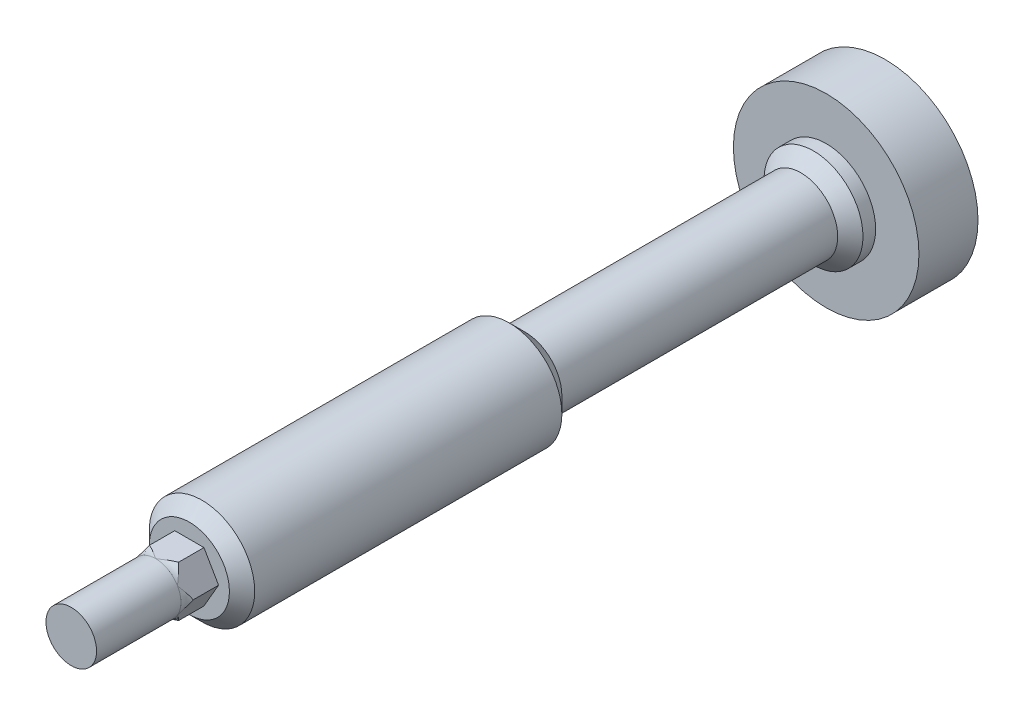
ISO-10303-21;
HEADER;
FILE_DESCRIPTION(('STEP AP214'),'2;1');
FILE_NAME('part.step','',(''),(''),'','','');
FILE_SCHEMA(('AUTOMOTIVE_DESIGN { 1 0 10303 214 1 1 1 1 }'));
ENDSEC;
DATA;
#1=APPLICATION_CONTEXT('core data for automotive mechanical design processes');
#2=APPLICATION_PROTOCOL_DEFINITION('international standard','automotive_design',2000,#1);
#3=PRODUCT_CONTEXT('',#1,'mechanical');
#4=PRODUCT('Part','Part','',(#3));
#5=PRODUCT_RELATED_PRODUCT_CATEGORY('part','',(#4));
#6=PRODUCT_DEFINITION_FORMATION('','',#4);
#7=PRODUCT_DEFINITION_CONTEXT('part definition',#1,'design');
#8=PRODUCT_DEFINITION('design','',#6,#7);
#9=PRODUCT_DEFINITION_SHAPE('','',#8);
#10=(LENGTH_UNIT() NAMED_UNIT(*) SI_UNIT(.MILLI.,.METRE.));
#11=(NAMED_UNIT(*) PLANE_ANGLE_UNIT() SI_UNIT($,.RADIAN.));
#12=(NAMED_UNIT(*) SI_UNIT($,.STERADIAN.) SOLID_ANGLE_UNIT());
#13=UNCERTAINTY_MEASURE_WITH_UNIT(LENGTH_MEASURE(1.E-05),#10,'distance_accuracy_value','');
#14=(GEOMETRIC_REPRESENTATION_CONTEXT(3) GLOBAL_UNCERTAINTY_ASSIGNED_CONTEXT((#13)) GLOBAL_UNIT_ASSIGNED_CONTEXT((#10,
#11,#12)) REPRESENTATION_CONTEXT('',''));
#15=CARTESIAN_POINT('',(0.,0.,0.));
#16=DIRECTION('',(0.,0.,1.));
#17=DIRECTION('',(1.,0.,0.));
#18=AXIS2_PLACEMENT_3D('',#15,#16,#17);
#19=CARTESIAN_POINT('',(1.73205080756888,-3.,14.));
#20=DIRECTION('',(-0.866025403784439,0.499999999999999,0.));
#21=DIRECTION('',(-0.499999999999999,-0.866025403784439,0.));
#22=AXIS2_PLACEMENT_3D('',#19,#20,#21);
#23=PLANE('',#22);
#24=CARTESIAN_POINT('',(2.59807621135332,-1.5,4.));
#25=CARTESIAN_POINT('',(2.599599533553,-1.49736152855384,3.99798721601837));
#26=CARTESIAN_POINT('',(2.60112285493995,-1.49472305851539,3.9959744315867));
#27=CARTESIAN_POINT('',(2.69421432975069,-1.33348389439165,3.8729727752807));
#28=CARTESIAN_POINT('',(2.78579879971617,-1.17485493922718,3.7520406323784));
#29=CARTESIAN_POINT('',(2.97118279688303,-0.853760437224003,3.51747525539667));
#30=CARTESIAN_POINT('',(3.06497896578776,-0.69130070712569,3.40383182139355));
#31=CARTESIAN_POINT('',(3.20922966384739,-0.441451169059126,3.24433248312488));
#32=CARTESIAN_POINT('',(3.25810359156913,-0.356799043079634,3.19281450562385));
#33=CARTESIAN_POINT('',(3.35708417718983,-0.185359639821659,3.09486519304067));
#34=CARTESIAN_POINT('',(3.40719011852256,-0.0985736036723064,3.04843098299515));
#35=CARTESIAN_POINT('',(3.5091899446179,0.0780952774880227,2.96159736959385));
#36=CARTESIAN_POINT('',(3.56109490880566,0.167997312626272,2.9212490974226));
#37=CARTESIAN_POINT('',(3.66640306272262,0.350396385661716,2.84856759575737));
#38=CARTESIAN_POINT('',(3.71980921111245,0.442898548109464,2.81625164013146));
#39=CARTESIAN_POINT('',(3.77390202125899,0.536590043607451,2.78880943720969));
#40=B_SPLINE_CURVE_WITH_KNOTS('',3,(#24,#25,#26,#27,#28,#29,#30,#31,#32,#33,#34,#35,#36,#37,#38,
#39),.UNSPECIFIED.,.F.,.F.,(4,2,2,2,2,2,2,4),(0.,0.0109544511501199,0.669433908200344,
1.32697081357057,1.65833374603016,1.98950830806198,2.3233264484579,2.65785638686686),.UNSPECIFIED.);
#41=CARTESIAN_POINT('',(2.59807621135332,-1.5,4.));
#42=VERTEX_POINT('',#41);
#43=CARTESIAN_POINT('',(3.46410161513775,0.,3.));
#44=VERTEX_POINT('',#43);
#45=EDGE_CURVE('E171',#42,#44,#40,.T.);
#46=ORIENTED_EDGE('',*,*,#45,.F.);
#47=CARTESIAN_POINT('',(2.59807621135332,-1.5,4.));
#48=CARTESIAN_POINT('',(2.59655288915364,-1.50263847144614,3.99798721601835));
#49=CARTESIAN_POINT('',(2.5950295677667,-1.50527694148457,3.99597443158666));
#50=CARTESIAN_POINT('',(2.50193809295646,-1.66651610560741,3.87297277527947));
#51=CARTESIAN_POINT('',(2.41035362299075,-1.8251450607723,3.75204063237828));
#52=CARTESIAN_POINT('',(2.22496962582385,-2.14623956277559,3.51747525539746));
#53=CARTESIAN_POINT('',(2.13117345691929,-2.30869929287359,3.40383182139413));
#54=CARTESIAN_POINT('',(1.9869227588598,-2.55854883093991,3.24433248312542));
#55=CARTESIAN_POINT('',(1.93804883113807,-2.64320095691939,3.19281450562441));
#56=CARTESIAN_POINT('',(1.8390682455174,-2.81464036017732,3.09486519304124));
#57=CARTESIAN_POINT('',(1.78896230418469,-2.90142639632664,3.0484309829957));
#58=CARTESIAN_POINT('',(1.68696247808942,-3.07809527748682,2.9615973695944));
#59=CARTESIAN_POINT('',(1.63505751390173,-3.16799731262495,2.92124909742317));
#60=CARTESIAN_POINT('',(1.52974935998492,-3.35039638566015,2.84856759575795));
#61=CARTESIAN_POINT('',(1.47634321159517,-3.44289854810776,2.81625164013202));
#62=CARTESIAN_POINT('',(1.42225040144871,-3.53659004360561,2.78880943721023));
#63=B_SPLINE_CURVE_WITH_KNOTS('',3,(#47,#48,#49,#50,#51,#52,#53,#54,#55,#56,#57,#58,#59,#60,#61,
#62),.UNSPECIFIED.,.F.,.F.,(4,2,2,2,2,2,2,4),(0.,0.0109544511501199,0.669433908199705,
1.32697081356937,1.65833374602888,1.98950830806062,2.32332644845615,2.65785638686467),.UNSPECIFIED.);
#64=CARTESIAN_POINT('',(1.73205080756888,-3.,3.));
#65=VERTEX_POINT('',#64);
#66=EDGE_CURVE('E225',#65,#42,#63,.F.);
#67=ORIENTED_EDGE('',*,*,#66,.F.);
#68=DIRECTION('',(0.,0.,-1.));
#69=VECTOR('',#68,1.);
#70=CARTESIAN_POINT('',(1.73205080756888,-3.,14.));
#71=LINE('',#70,#69);
#72=CARTESIAN_POINT('',(1.73205080756888,-3.,0.));
#73=VERTEX_POINT('',#72);
#74=EDGE_CURVE('E355',#65,#73,#71,.T.);
#75=ORIENTED_EDGE('',*,*,#74,.T.);
#76=DIRECTION('',(0.499999999999999,0.866025403784439,0.));
#77=VECTOR('',#76,1.);
#78=CARTESIAN_POINT('',(1.73205080756888,-3.,0.));
#79=LINE('',#78,#77);
#80=CARTESIAN_POINT('',(3.46410161513775,0.,0.));
#81=VERTEX_POINT('',#80);
#82=EDGE_CURVE('E375',#73,#81,#79,.T.);
#83=ORIENTED_EDGE('',*,*,#82,.T.);
#84=DIRECTION('',(0.,0.,-1.));
#85=VECTOR('',#84,1.);
#86=CARTESIAN_POINT('',(3.46410161513775,0.,14.));
#87=LINE('',#86,#85);
#88=EDGE_CURVE('E341',#44,#81,#87,.T.);
#89=ORIENTED_EDGE('',*,*,#88,.F.);
#90=EDGE_LOOP('',(#46,#67,#75,#83,#89));
#91=FACE_BOUND('',#90,.T.);
#92=ADVANCED_FACE('F42',(#91),#23,.F.);
#93=CARTESIAN_POINT('',(3.46410161513775,0.,14.));
#94=DIRECTION('',(-0.866025403784438,-0.5,0.));
#95=DIRECTION('',(0.5,-0.866025403784439,0.));
#96=AXIS2_PLACEMENT_3D('',#93,#94,#95);
#97=PLANE('',#96);
#98=CARTESIAN_POINT('',(2.59807621135332,1.5,4.));
#99=CARTESIAN_POINT('',(2.59655288915363,1.50263847144616,3.99798721601837));
#100=CARTESIAN_POINT('',(2.59502956776668,1.5052769414846,3.9959744315867));
#101=CARTESIAN_POINT('',(2.50193809295593,1.66651610560834,3.8729727752807));
#102=CARTESIAN_POINT('',(2.41035362299045,1.82514506077281,3.7520406323784));
#103=CARTESIAN_POINT('',(2.22496962582361,2.146239562776,3.51747525539667));
#104=CARTESIAN_POINT('',(2.13117345691887,2.30869929287431,3.40383182139355));
#105=CARTESIAN_POINT('',(1.98692275885924,2.55854883094088,3.24433248312487));
#106=CARTESIAN_POINT('',(1.9380488311375,2.64320095692037,3.19281450562384));
#107=CARTESIAN_POINT('',(1.8390682455168,2.81464036017835,3.09486519304067));
#108=CARTESIAN_POINT('',(1.78896230418407,2.9014263963277,3.04843098299515));
#109=CARTESIAN_POINT('',(1.68696247808872,3.07809527748803,2.96159736959384));
#110=CARTESIAN_POINT('',(1.63505751390096,3.16799731262628,2.9212490974226));
#111=CARTESIAN_POINT('',(1.52974935998401,3.35039638566173,2.84856759575737));
#112=CARTESIAN_POINT('',(1.47634321159418,3.44289854810947,2.81625164013145));
#113=CARTESIAN_POINT('',(1.42225040144763,3.53659004360746,2.78880943720969));
#114=B_SPLINE_CURVE_WITH_KNOTS('',3,(#98,#99,#100,#101,#102,#103,#104,#105,#106,#107,#108,#109,
#110,#111,#112,#113),.UNSPECIFIED.,.F.,.F.,(4,2,2,2,2,2,2,4),(0.,0.01095445115012,
0.66943390820035,1.32697081357058,1.65833374603018,1.98950830806199,2.32332644845792,
2.65785638686687),.UNSPECIFIED.);
#115=CARTESIAN_POINT('',(2.59807621135332,1.5,4.));
#116=VERTEX_POINT('',#115);
#117=CARTESIAN_POINT('',(1.73205080756888,3.,3.));
#118=VERTEX_POINT('',#117);
#119=EDGE_CURVE('E142',#116,#118,#114,.T.);
#120=ORIENTED_EDGE('',*,*,#119,.F.);
#121=CARTESIAN_POINT('',(2.59807621135332,1.5,4.));
#122=CARTESIAN_POINT('',(2.59959953355299,1.49736152855387,3.99798721601834));
#123=CARTESIAN_POINT('',(2.60112285493993,1.49472305851544,3.99597443158664));
#124=CARTESIAN_POINT('',(2.6942143297499,1.33348389439304,3.87297277527887));
#125=CARTESIAN_POINT('',(2.78579879971574,1.17485493922795,3.75204063237823));
#126=CARTESIAN_POINT('',(2.97118279688267,0.853760437224613,3.51747525539785));
#127=CARTESIAN_POINT('',(3.06497896578714,0.691300707126764,3.40383182139442));
#128=CARTESIAN_POINT('',(3.20922966384657,0.441451169060558,3.24433248312569));
#129=CARTESIAN_POINT('',(3.25810359156829,0.356799043081089,3.19281450562469));
#130=CARTESIAN_POINT('',(3.35708417718895,0.185359639823183,3.09486519304152));
#131=CARTESIAN_POINT('',(3.40719011852165,0.0985736036738755,3.04843098299597));
#132=CARTESIAN_POINT('',(3.50918994461687,-0.0780952774862371,2.96159736959467));
#133=CARTESIAN_POINT('',(3.56109490880453,-0.167997312624312,2.92124909742345));
#134=CARTESIAN_POINT('',(3.66640306272127,-0.350396385659384,2.84856759575823));
#135=CARTESIAN_POINT('',(3.71980921111099,-0.442898548106933,2.8162516401323));
#136=CARTESIAN_POINT('',(3.77390202125741,-0.536590043604715,2.78880943721049));
#137=B_SPLINE_CURVE_WITH_KNOTS('',3,(#121,#122,#123,#124,#125,#126,#127,#128,#129,#130,#131,
#132,#133,#134,#135,#136),.UNSPECIFIED.,.F.,.F.,(4,2,2,2,2,2,2,4),(0.,0.0109544511501195,
0.669433908199392,1.32697081356878,1.65833374602825,1.98950830805996,2.3233264484553,
2.65785638686361),.UNSPECIFIED.);
#138=EDGE_CURVE('E165',#44,#116,#137,.F.);
#139=ORIENTED_EDGE('',*,*,#138,.F.);
#140=ORIENTED_EDGE('',*,*,#88,.T.);
#141=DIRECTION('',(-0.5,0.866025403784439,0.));
#142=VECTOR('',#141,1.);
#143=CARTESIAN_POINT('',(3.46410161513775,0.,0.));
#144=LINE('',#143,#142);
#145=CARTESIAN_POINT('',(1.73205080756888,3.,0.));
#146=VERTEX_POINT('',#145);
#147=EDGE_CURVE('E372',#81,#146,#144,.T.);
#148=ORIENTED_EDGE('',*,*,#147,.T.);
#149=DIRECTION('',(0.,0.,-1.));
#150=VECTOR('',#149,1.);
#151=CARTESIAN_POINT('',(1.73205080756888,3.,14.));
#152=LINE('',#151,#150);
#153=EDGE_CURVE('E344',#118,#146,#152,.T.);
#154=ORIENTED_EDGE('',*,*,#153,.F.);
#155=EDGE_LOOP('',(#120,#139,#140,#148,#154));
#156=FACE_BOUND('',#155,.T.);
#157=ADVANCED_FACE('F261',(#156),#97,.F.);
#158=CARTESIAN_POINT('',(1.73205080756888,3.,14.));
#159=DIRECTION('',(0.,-1.,0.));
#160=DIRECTION('',(1.,0.,0.));
#161=AXIS2_PLACEMENT_3D('',#158,#159,#160);
#162=PLANE('',#161);
#163=CARTESIAN_POINT('',(0.,3.,4.));
#164=CARTESIAN_POINT('',(-0.00304664242886925,3.,3.99798721785063));
#165=CARTESIAN_POINT('',(-0.00609328523506538,3.,3.99597443338881));
#166=CARTESIAN_POINT('',(-0.193668665200186,2.99999999999999,3.87205283667219));
#167=CARTESIAN_POINT('',(-0.37823752327317,3.,3.750195120646));
#168=CARTESIAN_POINT('',(-0.752344298595047,3.,3.51367741960016));
#169=CARTESIAN_POINT('',(-0.941887200009458,3.,3.39902507798546));
#170=CARTESIAN_POINT('',(-1.32869087993365,3.,3.18587267007861));
#171=CARTESIAN_POINT('',(-1.52590203185111,3.,3.08728504877374));
#172=CARTESIAN_POINT('',(-1.93100279537539,3.,2.91575979696371));
#173=CARTESIAN_POINT('',(-2.13885263606816,3.,2.84273363961717));
#174=CARTESIAN_POINT('',(-2.49303136016625,3.,2.75298318653353));
#175=CARTESIAN_POINT('',(-2.63659566701067,3.,2.72558859568115));
#176=CARTESIAN_POINT('',(-2.92596214329407,3.,2.6923260839869));
#177=CARTESIAN_POINT('',(-3.07175467515037,3.,2.68638285030505));
#178=CARTESIAN_POINT('',(-3.32547640929926,3.,2.69908024292703));
#179=CARTESIAN_POINT('',(-3.43366060869138,3.,2.71188614941616));
#180=CARTESIAN_POINT('',(-3.64754526403645,3.,2.75450885431063));
#181=CARTESIAN_POINT('',(-3.75321543462677,3.,2.78447455052692));
#182=CARTESIAN_POINT('',(-3.85571869660119,3.,2.82406496439945));
#183=B_SPLINE_CURVE_WITH_KNOTS('',3,(#163,#164,#165,#166,#167,#168,#169,#170,#171,#172,#173,
#174,#175,#176,#177,#178,#179,#180,#181,#182),.UNSPECIFIED.,.F.,.F.,(4,2,2,2,2,2,2,2,2,4),(0.,
0.0109544511501202,0.674440060517647,1.33861800667784,1.99904537494895,2.65716231713276,
3.09440313837515,3.53010736429974,3.85567082698896,4.18410300415164),.UNSPECIFIED.);
#184=CARTESIAN_POINT('',(0.,3.,4.));
#185=VERTEX_POINT('',#184);
#186=CARTESIAN_POINT('',(-1.73205080756888,3.,3.));
#187=VERTEX_POINT('',#186);
#188=EDGE_CURVE('E136',#185,#187,#183,.T.);
#189=ORIENTED_EDGE('',*,*,#188,.F.);
#190=CARTESIAN_POINT('',(0.,3.,4.));
#191=CARTESIAN_POINT('',(0.00304664242886842,3.,3.99798721785063));
#192=CARTESIAN_POINT('',(0.00609328523506447,3.,3.99597443338881));
#193=CARTESIAN_POINT('',(0.193668665200183,3.,3.87205283667218));
#194=CARTESIAN_POINT('',(0.378237523273169,3.,3.750195120646));
#195=CARTESIAN_POINT('',(0.752344298595045,3.,3.51367741960016));
#196=CARTESIAN_POINT('',(0.941887200009455,3.,3.39902507798546));
#197=CARTESIAN_POINT('',(1.32869087993365,3.,3.18587267007861));
#198=CARTESIAN_POINT('',(1.52590203185111,3.,3.08728504877374));
#199=CARTESIAN_POINT('',(1.93100279537539,3.,2.91575979696371));
#200=CARTESIAN_POINT('',(2.13885263606816,3.,2.84273363961717));
#201=CARTESIAN_POINT('',(2.49303136016624,3.,2.75298318653353));
#202=CARTESIAN_POINT('',(2.63659566701067,3.,2.72558859568115));
#203=CARTESIAN_POINT('',(2.92596214329407,3.,2.6923260839869));
#204=CARTESIAN_POINT('',(3.07175467515036,3.,2.68638285030505));
#205=CARTESIAN_POINT('',(3.32547640929925,3.,2.69908024292703));
#206=CARTESIAN_POINT('',(3.43366060869138,3.,2.71188614941615));
#207=CARTESIAN_POINT('',(3.64754526403645,3.,2.75450885431063));
#208=CARTESIAN_POINT('',(3.75321543462677,3.,2.78447455052692));
#209=CARTESIAN_POINT('',(3.85571869660118,3.,2.82406496439944));
#210=B_SPLINE_CURVE_WITH_KNOTS('',3,(#190,#191,#192,#193,#194,#195,#196,#197,#198,#199,#200,
#201,#202,#203,#204,#205,#206,#207,#208,#209),.UNSPECIFIED.,.F.,.F.,(4,2,2,2,2,2,2,2,2,4),(0.,
0.01095445115012,0.674440060517646,1.33861800667783,1.99904537494895,2.65716231713276,
3.09440313837514,3.53010736429974,3.85567082698896,4.18410300415163),.UNSPECIFIED.);
#211=EDGE_CURVE('E141',#118,#185,#210,.F.);
#212=ORIENTED_EDGE('',*,*,#211,.F.);
#213=ORIENTED_EDGE('',*,*,#153,.T.);
#214=DIRECTION('',(-1.,0.,0.));
#215=VECTOR('',#214,1.);
#216=CARTESIAN_POINT('',(1.73205080756888,3.,0.));
#217=LINE('',#216,#215);
#218=CARTESIAN_POINT('',(-1.73205080756888,3.,0.));
#219=VERTEX_POINT('',#218);
#220=EDGE_CURVE('E368',#146,#219,#217,.T.);
#221=ORIENTED_EDGE('',*,*,#220,.T.);
#222=DIRECTION('',(0.,0.,-1.));
#223=VECTOR('',#222,1.);
#224=CARTESIAN_POINT('',(-1.73205080756888,3.,14.));
#225=LINE('',#224,#223);
#226=EDGE_CURVE('E347',#187,#219,#225,.T.);
#227=ORIENTED_EDGE('',*,*,#226,.F.);
#228=EDGE_LOOP('',(#189,#212,#213,#221,#227));
#229=FACE_BOUND('',#228,.T.);
#230=ADVANCED_FACE('F258',(#229),#162,.F.);
#231=CARTESIAN_POINT('',(-1.73205080756888,3.,14.));
#232=DIRECTION('',(0.866025403784439,-0.499999999999999,0.));
#233=DIRECTION('',(0.5,0.866025403784439,0.));
#234=AXIS2_PLACEMENT_3D('',#231,#232,#233);
#235=PLANE('',#234);
#236=CARTESIAN_POINT('',(-2.59807621135332,1.5,4.));
#237=CARTESIAN_POINT('',(-2.59959953355302,1.49736152855381,3.99798721601843));
#238=CARTESIAN_POINT('',(-2.60112285493998,1.49472305851534,3.9959744315868));
#239=CARTESIAN_POINT('',(-2.69421432975188,1.33348389438958,3.87297277528345));
#240=CARTESIAN_POINT('',(-2.78579879971683,1.17485493922604,3.75204063237867));
#241=CARTESIAN_POINT('',(-2.97118279688355,0.853760437223093,3.51747525539492));
#242=CARTESIAN_POINT('',(-3.06497896578868,0.691300707124087,3.40383182139225));
#243=CARTESIAN_POINT('',(-3.20922966384862,0.441451169056989,3.24433248312365));
#244=CARTESIAN_POINT('',(-3.25810359157038,0.356799043077462,3.19281450562258));
#245=CARTESIAN_POINT('',(-3.35708417719114,0.185359639819384,3.0948651930394));
#246=CARTESIAN_POINT('',(-3.40719011852391,0.0985736036699641,3.04843098299392));
#247=CARTESIAN_POINT('',(-3.50918994461944,-0.0780952774906881,2.96159736959262));
#248=CARTESIAN_POINT('',(-3.56109490880735,-0.167997312629198,2.92124909742133));
#249=CARTESIAN_POINT('',(-3.66640306272463,-0.3503963856652,2.84856759575609));
#250=CARTESIAN_POINT('',(-3.71980921111463,-0.442898548113245,2.81625164013019));
#251=CARTESIAN_POINT('',(-3.77390202126135,-0.536590043611539,2.78880943720849));
#252=B_SPLINE_CURVE_WITH_KNOTS('',3,(#236,#237,#238,#239,#240,#241,#242,#243,#244,#245,#246,
#247,#248,#249,#250,#251),.UNSPECIFIED.,.F.,.F.,(4,2,2,2,2,2,2,4),(0.,0.0109544511501192,
0.66943390820177,1.32697081357325,1.65833374603303,1.98950830806499,2.3233264484618,
2.65785638687172),.UNSPECIFIED.);
#253=CARTESIAN_POINT('',(-2.59807621135332,1.5,4.));
#254=VERTEX_POINT('',#253);
#255=CARTESIAN_POINT('',(-3.46410161513775,0.,3.));
#256=VERTEX_POINT('',#255);
#257=EDGE_CURVE('E148',#254,#256,#252,.T.);
#258=ORIENTED_EDGE('',*,*,#257,.F.);
#259=CARTESIAN_POINT('',(-2.59807621135332,1.5,4.));
#260=CARTESIAN_POINT('',(-2.59655288915362,1.50263847144616,3.99798721601839));
#261=CARTESIAN_POINT('',(-2.59502956776667,1.50527694148462,3.99597443158674));
#262=CARTESIAN_POINT('',(-2.50193809295551,1.66651610560902,3.87297277528162));
#263=CARTESIAN_POINT('',(-2.41035362299023,1.82514506077319,3.75204063237849));
#264=CARTESIAN_POINT('',(-2.22496962582344,2.1462395627763,3.51747525539609));
#265=CARTESIAN_POINT('',(-2.13117345691857,2.30869929287484,3.40383182139312));
#266=CARTESIAN_POINT('',(-1.98692275885883,2.55854883094159,3.24433248312447));
#267=CARTESIAN_POINT('',(-1.93804883113709,2.64320095692109,3.19281450562342));
#268=CARTESIAN_POINT('',(-1.83906824551637,2.8146403601791,3.09486519304025));
#269=CARTESIAN_POINT('',(-1.78896230418362,2.90142639632848,3.04843098299474));
#270=CARTESIAN_POINT('',(-1.68696247808822,3.07809527748891,2.96159736959344));
#271=CARTESIAN_POINT('',(-1.6350575139004,3.16799731262725,2.92124909742218));
#272=CARTESIAN_POINT('',(-1.52974935998334,3.35039638566288,2.84856759575694));
#273=CARTESIAN_POINT('',(-1.47634321159345,3.44289854811073,2.81625164013103));
#274=CARTESIAN_POINT('',(-1.42225040144685,3.53659004360882,2.78880943720929));
#275=B_SPLINE_CURVE_WITH_KNOTS('',3,(#259,#260,#261,#262,#263,#264,#265,#266,#267,#268,#269,
#270,#271,#272,#273,#274),.UNSPECIFIED.,.F.,.F.,(4,2,2,2,2,2,2,4),(0.,0.0109544511501208,
0.669433908200823,1.32697081357147,1.65833374603113,1.98950830806299,2.32332644845921,
2.65785638686849),.UNSPECIFIED.);
#276=EDGE_CURVE('E129',#187,#254,#275,.F.);
#277=ORIENTED_EDGE('',*,*,#276,.F.);
#278=ORIENTED_EDGE('',*,*,#226,.T.);
#279=DIRECTION('',(-0.499999999999999,-0.866025403784439,0.));
#280=VECTOR('',#279,1.);
#281=CARTESIAN_POINT('',(-1.73205080756888,3.,0.));
#282=LINE('',#281,#280);
#283=CARTESIAN_POINT('',(-3.46410161513775,0.,0.));
#284=VERTEX_POINT('',#283);
#285=EDGE_CURVE('E366',#219,#284,#282,.T.);
#286=ORIENTED_EDGE('',*,*,#285,.T.);
#287=DIRECTION('',(0.,0.,-1.));
#288=VECTOR('',#287,1.);
#289=CARTESIAN_POINT('',(-3.46410161513775,0.,14.));
#290=LINE('',#289,#288);
#291=EDGE_CURVE('E163',#256,#284,#290,.T.);
#292=ORIENTED_EDGE('',*,*,#291,.F.);
#293=EDGE_LOOP('',(#258,#277,#278,#286,#292));
#294=FACE_BOUND('',#293,.T.);
#295=ADVANCED_FACE('F161',(#294),#235,.F.);
#296=CARTESIAN_POINT('',(-3.46410161513775,0.,14.));
#297=DIRECTION('',(0.866025403784438,0.5,0.));
#298=DIRECTION('',(-0.5,0.866025403784438,0.));
#299=AXIS2_PLACEMENT_3D('',#296,#297,#298);
#300=PLANE('',#299);
#301=CARTESIAN_POINT('',(-2.59807621135332,-1.5,4.));
#302=CARTESIAN_POINT('',(-2.59655288915363,-1.50263847144616,3.99798721601838));
#303=CARTESIAN_POINT('',(-2.59502956776668,-1.50527694148461,3.99597443158671));
#304=CARTESIAN_POINT('',(-2.50193809295579,-1.66651610560857,3.87297277528101));
#305=CARTESIAN_POINT('',(-2.41035362299038,-1.82514506077294,3.75204063237843));
#306=CARTESIAN_POINT('',(-2.22496962582355,-2.1462395627761,3.51747525539648));
#307=CARTESIAN_POINT('',(-2.13117345691877,-2.30869929287448,3.40383182139341));
#308=CARTESIAN_POINT('',(-1.9869227588591,-2.55854883094111,3.24433248312474));
#309=CARTESIAN_POINT('',(-1.93804883113737,-2.6432009569206,3.19281450562371));
#310=CARTESIAN_POINT('',(-1.83906824551666,-2.81464036017859,3.09486519304053));
#311=CARTESIAN_POINT('',(-1.78896230418393,-2.90142639632795,3.04843098299502));
#312=CARTESIAN_POINT('',(-1.68696247808856,-3.07809527748831,2.96159736959371));
#313=CARTESIAN_POINT('',(-1.63505751390078,-3.16799731262659,2.92124909742246));
#314=CARTESIAN_POINT('',(-1.52974935998379,-3.3503963856621,2.84856759575723));
#315=CARTESIAN_POINT('',(-1.47634321159394,-3.44289854810988,2.81625164013132));
#316=CARTESIAN_POINT('',(-1.42225040144738,-3.5365900436079,2.78880943720956));
#317=B_SPLINE_CURVE_WITH_KNOTS('',3,(#301,#302,#303,#304,#305,#306,#307,#308,#309,#310,#311,
#312,#313,#314,#315,#316),.UNSPECIFIED.,.F.,.F.,(4,2,2,2,2,2,2,4),(0.,0.0109544511501195,
0.669433908200502,1.32697081357087,1.65833374603048,1.98950830806231,2.32332644845833,
2.65785638686739),.UNSPECIFIED.);
#318=CARTESIAN_POINT('',(-2.59807621135332,-1.5,4.));
#319=VERTEX_POINT('',#318);
#320=CARTESIAN_POINT('',(-1.73205080756888,-3.,3.));
#321=VERTEX_POINT('',#320);
#322=EDGE_CURVE('E68',#319,#321,#317,.T.);
#323=ORIENTED_EDGE('',*,*,#322,.F.);
#324=CARTESIAN_POINT('',(-2.59807621135332,-1.5,4.));
#325=CARTESIAN_POINT('',(-2.59959953355299,-1.49736152855386,3.99798721601835));
#326=CARTESIAN_POINT('',(-2.60112285493993,-1.49472305851543,3.99597443158665));
#327=CARTESIAN_POINT('',(-2.69421432975003,-1.33348389439281,3.87297277527917));
#328=CARTESIAN_POINT('',(-2.78579879971581,-1.17485493922782,3.75204063237826));
#329=CARTESIAN_POINT('',(-2.97118279688273,-0.853760437224512,3.51747525539765));
#330=CARTESIAN_POINT('',(-3.06497896578724,-0.691300707126588,3.40383182139428));
#331=CARTESIAN_POINT('',(-3.2092296638467,-0.441451169060323,3.24433248312556));
#332=CARTESIAN_POINT('',(-3.25810359156843,-0.35679904308085,3.19281450562455));
#333=CARTESIAN_POINT('',(-3.35708417718909,-0.185359639822933,3.09486519304138));
#334=CARTESIAN_POINT('',(-3.4071901185218,-0.0985736036736186,3.04843098299584));
#335=CARTESIAN_POINT('',(-3.50918994461704,0.0780952774865295,2.96159736959454));
#336=CARTESIAN_POINT('',(-3.56109490880472,0.167997312624633,2.92124909742331));
#337=CARTESIAN_POINT('',(-3.66640306272149,0.350396385659766,2.84856759575809));
#338=CARTESIAN_POINT('',(-3.71980921111123,0.442898548107349,2.81625164013216));
#339=CARTESIAN_POINT('',(-3.77390202125767,0.536590043605164,2.78880943721036));
#340=B_SPLINE_CURVE_WITH_KNOTS('',3,(#324,#325,#326,#327,#328,#329,#330,#331,#332,#333,#334,
#335,#336,#337,#338,#339),.UNSPECIFIED.,.F.,.F.,(4,2,2,2,2,2,2,4),(0.,0.0109544511501205,
0.66943390819955,1.32697081356908,1.65833374602856,1.98950830806029,2.32332644845572,
2.65785638686414),.UNSPECIFIED.);
#341=EDGE_CURVE('E150',#256,#319,#340,.F.);
#342=ORIENTED_EDGE('',*,*,#341,.F.);
#343=ORIENTED_EDGE('',*,*,#291,.T.);
#344=DIRECTION('',(0.5,-0.866025403784438,0.));
#345=VECTOR('',#344,1.);
#346=CARTESIAN_POINT('',(-3.46410161513775,0.,0.));
#347=LINE('',#346,#345);
#348=CARTESIAN_POINT('',(-1.73205080756888,-3.,0.));
#349=VERTEX_POINT('',#348);
#350=EDGE_CURVE('E362',#284,#349,#347,.T.);
#351=ORIENTED_EDGE('',*,*,#350,.T.);
#352=DIRECTION('',(0.,0.,-1.));
#353=VECTOR('',#352,1.);
#354=CARTESIAN_POINT('',(-1.73205080756888,-3.,14.));
#355=LINE('',#354,#353);
#356=EDGE_CURVE('E352',#321,#349,#355,.T.);
#357=ORIENTED_EDGE('',*,*,#356,.F.);
#358=EDGE_LOOP('',(#323,#342,#343,#351,#357));
#359=FACE_BOUND('',#358,.T.);
#360=ADVANCED_FACE('F417',(#359),#300,.F.);
#361=CARTESIAN_POINT('',(-1.73205080756888,-3.,14.));
#362=DIRECTION('',(0.,1.,0.));
#363=DIRECTION('',(-1.,0.,0.));
#364=AXIS2_PLACEMENT_3D('',#361,#362,#363);
#365=PLANE('',#364);
#366=CARTESIAN_POINT('',(0.,-3.,4.));
#367=CARTESIAN_POINT('',(0.00304664242886225,-3.,3.99798721785062));
#368=CARTESIAN_POINT('',(0.00609328523505122,-3.,3.99597443338879));
#369=CARTESIAN_POINT('',(0.193668665199652,-3.,3.87205283667158));
#370=CARTESIAN_POINT('',(0.378237523272861,-3.,3.75019512064595));
#371=CARTESIAN_POINT('',(0.752344298594782,-3.,3.51367741960057));
#372=CARTESIAN_POINT('',(0.941887200009013,-3.,3.39902507798578));
#373=CARTESIAN_POINT('',(1.32869087993298,-3.,3.18587267007889));
#374=CARTESIAN_POINT('',(1.5259020318504,-3.,3.08728504877406));
#375=CARTESIAN_POINT('',(1.93100279537455,-3.,2.91575979696405));
#376=CARTESIAN_POINT('',(2.13885263606722,-3.,2.84273363961748));
#377=CARTESIAN_POINT('',(2.49303136016529,-3.,2.75298318653373));
#378=CARTESIAN_POINT('',(2.63659566700979,-3.,2.72558859568129));
#379=CARTESIAN_POINT('',(2.92596214329333,-3.,2.69232608398695));
#380=CARTESIAN_POINT('',(3.07175467514969,-3.,2.68638285030505));
#381=CARTESIAN_POINT('',(3.32547640929865,-3.,2.69908024292697));
#382=CARTESIAN_POINT('',(3.43366060869078,-3.,2.71188614941607));
#383=CARTESIAN_POINT('',(3.6475452640359,-3.,2.75450885431049));
#384=CARTESIAN_POINT('',(3.75321543462626,-3.,2.78447455052675));
#385=CARTESIAN_POINT('',(3.85571869660071,-3.,2.82406496439926));
#386=B_SPLINE_CURVE_WITH_KNOTS('',3,(#366,#367,#368,#369,#370,#371,#372,#373,#374,#375,#376,
#377,#378,#379,#380,#381,#382,#383,#384,#385),.UNSPECIFIED.,.F.,.F.,(4,2,2,2,2,2,2,2,2,4),(0.,
0.01095445115012,0.674440060517304,1.33861800667718,1.99904537494812,2.6571623171317,
3.09440313837435,3.53010736429913,3.85567082698837,4.18410300415113),.UNSPECIFIED.);
#387=CARTESIAN_POINT('',(0.,-3.,4.));
#388=VERTEX_POINT('',#387);
#389=EDGE_CURVE('E212',#388,#65,#386,.T.);
#390=ORIENTED_EDGE('',*,*,#389,.F.);
#391=CARTESIAN_POINT('',(0.,-3.,4.));
#392=CARTESIAN_POINT('',(-0.00304664242886059,-3.,3.99798721785062));
#393=CARTESIAN_POINT('',(-0.0060932852350494,-3.,3.99597443338879));
#394=CARTESIAN_POINT('',(-0.193668665199637,-3.,3.87205283667157));
#395=CARTESIAN_POINT('',(-0.378237523272852,-3.,3.75019512064595));
#396=CARTESIAN_POINT('',(-0.752344298594774,-3.,3.51367741960058));
#397=CARTESIAN_POINT('',(-0.941887200009,-3.,3.39902507798579));
#398=CARTESIAN_POINT('',(-1.32869087993296,-3.,3.1858726700789));
#399=CARTESIAN_POINT('',(-1.52590203185038,-3.,3.08728504877407));
#400=CARTESIAN_POINT('',(-1.93100279537452,-3.,2.91575979696405));
#401=CARTESIAN_POINT('',(-2.13885263606719,-3.,2.84273363961749));
#402=CARTESIAN_POINT('',(-2.49303136016526,-3.,2.75298318653373));
#403=CARTESIAN_POINT('',(-2.63659566700976,-3.,2.72558859568129));
#404=CARTESIAN_POINT('',(-2.92596214329331,-3.,2.69232608398695));
#405=CARTESIAN_POINT('',(-3.07175467514967,-3.,2.68638285030505));
#406=CARTESIAN_POINT('',(-3.32547640929863,-3.,2.69908024292697));
#407=CARTESIAN_POINT('',(-3.43366060869076,-3.,2.71188614941607));
#408=CARTESIAN_POINT('',(-3.64754526403588,-3.,2.75450885431049));
#409=CARTESIAN_POINT('',(-3.75321543462625,-3.,2.78447455052675));
#410=CARTESIAN_POINT('',(-3.8557186966007,-3.,2.82406496439926));
#411=B_SPLINE_CURVE_WITH_KNOTS('',3,(#391,#392,#393,#394,#395,#396,#397,#398,#399,#400,#401,
#402,#403,#404,#405,#406,#407,#408,#409,#410),.UNSPECIFIED.,.F.,.F.,(4,2,2,2,2,2,2,2,2,4),(0.,
0.0109544511501201,0.674440060517296,1.33861800667716,1.9990453749481,2.65716231713167,
3.09440313837433,3.53010736429911,3.85567082698835,4.18410300415112),.UNSPECIFIED.);
#412=EDGE_CURVE('E202',#321,#388,#411,.F.);
#413=ORIENTED_EDGE('',*,*,#412,.F.);
#414=ORIENTED_EDGE('',*,*,#356,.T.);
#415=DIRECTION('',(1.,0.,0.));
#416=VECTOR('',#415,1.);
#417=CARTESIAN_POINT('',(-1.73205080756888,-3.,0.));
#418=LINE('',#417,#416);
#419=EDGE_CURVE('E358',#349,#73,#418,.T.);
#420=ORIENTED_EDGE('',*,*,#419,.T.);
#421=ORIENTED_EDGE('',*,*,#74,.F.);
#422=EDGE_LOOP('',(#390,#413,#414,#420,#421));
#423=FACE_BOUND('',#422,.T.);
#424=ADVANCED_FACE('F310',(#423),#365,.F.);
#425=CARTESIAN_POINT('',(4.75,0.,0.));
#426=DIRECTION('',(0.,0.,1.));
#427=DIRECTION('',(1.,0.,0.));
#428=AXIS2_PLACEMENT_3D('',#425,#426,#427);
#429=PLANE('',#428);
#430=ORIENTED_EDGE('',*,*,#82,.F.);
#431=ORIENTED_EDGE('',*,*,#419,.F.);
#432=ORIENTED_EDGE('',*,*,#350,.F.);
#433=ORIENTED_EDGE('',*,*,#285,.F.);
#434=ORIENTED_EDGE('',*,*,#220,.F.);
#435=ORIENTED_EDGE('',*,*,#147,.F.);
#436=EDGE_LOOP('',(#430,#431,#432,#433,#434,#435));
#437=FACE_BOUND('',#436,.T.);
#438=CARTESIAN_POINT('',(0.,0.,0.));
#439=DIRECTION('',(0.,0.,1.));
#440=DIRECTION('',(1.,0.,0.));
#441=AXIS2_PLACEMENT_3D('',#438,#439,#440);
#442=CIRCLE('',#441,4.75);
#443=CARTESIAN_POINT('',(4.75,0.,0.));
#444=VERTEX_POINT('',#443);
#445=EDGE_CURVE('E337',#444,#444,#442,.T.);
#446=ORIENTED_EDGE('',*,*,#445,.T.);
#447=EDGE_LOOP('',(#446));
#448=FACE_BOUND('',#447,.T.);
#449=ADVANCED_FACE('F44',(#437,#448),#429,.T.);
#450=CARTESIAN_POINT('',(0.,0.,-82.5));
#451=DIRECTION('',(0.,0.,-1.));
#452=DIRECTION('',(-1.,0.,0.));
#453=AXIS2_PLACEMENT_3D('',#450,#451,#452);
#454=PLANE('',#453);
#455=CARTESIAN_POINT('',(0.,0.,-82.5));
#456=DIRECTION('',(0.,0.,1.));
#457=DIRECTION('',(1.,0.,0.));
#458=AXIS2_PLACEMENT_3D('',#455,#456,#457);
#459=CIRCLE('',#458,11.);
#460=CARTESIAN_POINT('',(11.,0.,-82.5));
#461=VERTEX_POINT('',#460);
#462=EDGE_CURVE('E51',#461,#461,#459,.T.);
#463=ORIENTED_EDGE('',*,*,#462,.F.);
#464=EDGE_LOOP('',(#463));
#465=FACE_BOUND('',#464,.T.);
#466=ADVANCED_FACE('F303',(#465),#454,.T.);
#467=CARTESIAN_POINT('',(0.,0.,0.));
#468=DIRECTION('',(0.,0.,1.));
#469=DIRECTION('',(1.,0.,0.));
#470=AXIS2_PLACEMENT_3D('',#467,#468,#469);
#471=CYLINDRICAL_SURFACE('',#470,11.);
#472=ORIENTED_EDGE('',*,*,#462,.T.);
#473=EDGE_LOOP('',(#472));
#474=FACE_BOUND('',#473,.T.);
#475=CARTESIAN_POINT('',(0.,0.,-75.5));
#476=DIRECTION('',(0.,0.,1.));
#477=DIRECTION('',(1.,0.,0.));
#478=AXIS2_PLACEMENT_3D('',#475,#476,#477);
#479=CIRCLE('',#478,11.);
#480=CARTESIAN_POINT('',(11.,0.,-75.5));
#481=VERTEX_POINT('',#480);
#482=EDGE_CURVE('E314',#481,#481,#479,.T.);
#483=ORIENTED_EDGE('',*,*,#482,.F.);
#484=EDGE_LOOP('',(#483));
#485=FACE_BOUND('',#484,.T.);
#486=ADVANCED_FACE('F300',(#474,#485),#471,.T.);
#487=CARTESIAN_POINT('',(11.,0.,-75.5));
#488=DIRECTION('',(0.,0.,1.));
#489=DIRECTION('',(1.,0.,0.));
#490=AXIS2_PLACEMENT_3D('',#487,#488,#489);
#491=PLANE('',#490);
#492=ORIENTED_EDGE('',*,*,#482,.T.);
#493=EDGE_LOOP('',(#492));
#494=FACE_BOUND('',#493,.T.);
#495=CARTESIAN_POINT('',(0.,0.,-75.5));
#496=DIRECTION('',(0.,0.,1.));
#497=DIRECTION('',(1.,0.,0.));
#498=AXIS2_PLACEMENT_3D('',#495,#496,#497);
#499=CIRCLE('',#498,5.865);
#500=CARTESIAN_POINT('',(5.865,0.,-75.5));
#501=VERTEX_POINT('',#500);
#502=EDGE_CURVE('E316',#501,#501,#499,.T.);
#503=ORIENTED_EDGE('',*,*,#502,.F.);
#504=EDGE_LOOP('',(#503));
#505=FACE_BOUND('',#504,.T.);
#506=ADVANCED_FACE('F296',(#494,#505),#491,.T.);
#507=CARTESIAN_POINT('',(0.,0.,0.));
#508=DIRECTION('',(0.,0.,1.));
#509=DIRECTION('',(1.,0.,0.));
#510=AXIS2_PLACEMENT_3D('',#507,#508,#509);
#511=CYLINDRICAL_SURFACE('',#510,5.86500000000001);
#512=ORIENTED_EDGE('',*,*,#502,.T.);
#513=EDGE_LOOP('',(#512));
#514=FACE_BOUND('',#513,.T.);
#515=CARTESIAN_POINT('',(0.,0.,-74.));
#516=DIRECTION('',(0.,0.,1.));
#517=DIRECTION('',(1.,0.,0.));
#518=AXIS2_PLACEMENT_3D('',#515,#516,#517);
#519=CIRCLE('',#518,5.86500000000001);
#520=CARTESIAN_POINT('',(5.86500000000001,0.,-74.));
#521=VERTEX_POINT('',#520);
#522=EDGE_CURVE('E321',#521,#521,#519,.T.);
#523=ORIENTED_EDGE('',*,*,#522,.F.);
#524=EDGE_LOOP('',(#523));
#525=FACE_BOUND('',#524,.T.);
#526=ADVANCED_FACE('F292',(#514,#525),#511,.T.);
#527=CARTESIAN_POINT('',(0.,0.,-72.5));
#528=DIRECTION('',(0.,0.,-1.));
#529=DIRECTION('',(-1.,0.,0.));
#530=AXIS2_PLACEMENT_3D('',#527,#528,#529);
#531=CONICAL_SURFACE('',#530,4.365,0.78539816339745);
#532=ORIENTED_EDGE('',*,*,#522,.T.);
#533=EDGE_LOOP('',(#532));
#534=FACE_BOUND('',#533,.T.);
#535=CARTESIAN_POINT('',(0.,0.,-72.5));
#536=DIRECTION('',(0.,0.,1.));
#537=DIRECTION('',(1.,0.,0.));
#538=AXIS2_PLACEMENT_3D('',#535,#536,#537);
#539=CIRCLE('',#538,4.365);
#540=CARTESIAN_POINT('',(4.365,0.,-72.5));
#541=VERTEX_POINT('',#540);
#542=EDGE_CURVE('E324',#541,#541,#539,.T.);
#543=ORIENTED_EDGE('',*,*,#542,.F.);
#544=EDGE_LOOP('',(#543));
#545=FACE_BOUND('',#544,.T.);
#546=ADVANCED_FACE('F288',(#534,#545),#531,.T.);
#547=CARTESIAN_POINT('',(0.,0.,0.));
#548=DIRECTION('',(0.,0.,1.));
#549=DIRECTION('',(1.,0.,0.));
#550=AXIS2_PLACEMENT_3D('',#547,#548,#549);
#551=CYLINDRICAL_SURFACE('',#550,4.365);
#552=ORIENTED_EDGE('',*,*,#542,.T.);
#553=EDGE_LOOP('',(#552));
#554=FACE_BOUND('',#553,.T.);
#555=CARTESIAN_POINT('',(0.,0.,-39.8));
#556=DIRECTION('',(0.,0.,1.));
#557=DIRECTION('',(1.,0.,0.));
#558=AXIS2_PLACEMENT_3D('',#555,#556,#557);
#559=CIRCLE('',#558,4.365);
#560=CARTESIAN_POINT('',(4.365,0.,-39.8));
#561=VERTEX_POINT('',#560);
#562=EDGE_CURVE('E327',#561,#561,#559,.T.);
#563=ORIENTED_EDGE('',*,*,#562,.F.);
#564=EDGE_LOOP('',(#563));
#565=FACE_BOUND('',#564,.T.);
#566=ADVANCED_FACE('F284',(#554,#565),#551,.T.);
#567=CARTESIAN_POINT('',(0.,0.,-37.915));
#568=DIRECTION('',(0.,0.,1.));
#569=DIRECTION('',(1.,0.,0.));
#570=AXIS2_PLACEMENT_3D('',#567,#568,#569);
#571=CONICAL_SURFACE('',#570,6.25,0.785398163397446);
#572=ORIENTED_EDGE('',*,*,#562,.T.);
#573=EDGE_LOOP('',(#572));
#574=FACE_BOUND('',#573,.T.);
#575=CARTESIAN_POINT('',(0.,0.,-37.915));
#576=DIRECTION('',(0.,0.,1.));
#577=DIRECTION('',(1.,0.,0.));
#578=AXIS2_PLACEMENT_3D('',#575,#576,#577);
#579=CIRCLE('',#578,6.25);
#580=CARTESIAN_POINT('',(6.25,0.,-37.915));
#581=VERTEX_POINT('',#580);
#582=EDGE_CURVE('E330',#581,#581,#579,.T.);
#583=ORIENTED_EDGE('',*,*,#582,.F.);
#584=EDGE_LOOP('',(#583));
#585=FACE_BOUND('',#584,.T.);
#586=ADVANCED_FACE('F280',(#574,#585),#571,.T.);
#587=CARTESIAN_POINT('',(0.,0.,0.));
#588=DIRECTION('',(0.,0.,1.));
#589=DIRECTION('',(1.,0.,0.));
#590=AXIS2_PLACEMENT_3D('',#587,#588,#589);
#591=CYLINDRICAL_SURFACE('',#590,6.25);
#592=ORIENTED_EDGE('',*,*,#582,.T.);
#593=EDGE_LOOP('',(#592));
#594=FACE_BOUND('',#593,.T.);
#595=CARTESIAN_POINT('',(0.,0.,-1.5));
#596=DIRECTION('',(0.,0.,1.));
#597=DIRECTION('',(1.,0.,0.));
#598=AXIS2_PLACEMENT_3D('',#595,#596,#597);
#599=CIRCLE('',#598,6.25);
#600=CARTESIAN_POINT('',(6.25,0.,-1.5));
#601=VERTEX_POINT('',#600);
#602=EDGE_CURVE('E333',#601,#601,#599,.T.);
#603=ORIENTED_EDGE('',*,*,#602,.F.);
#604=EDGE_LOOP('',(#603));
#605=FACE_BOUND('',#604,.T.);
#606=ADVANCED_FACE('F276',(#594,#605),#591,.T.);
#607=CARTESIAN_POINT('',(0.,0.,0.));
#608=DIRECTION('',(0.,0.,-1.));
#609=DIRECTION('',(-1.,0.,0.));
#610=AXIS2_PLACEMENT_3D('',#607,#608,#609);
#611=CONICAL_SURFACE('',#610,4.75,0.78539816339745);
#612=ORIENTED_EDGE('',*,*,#602,.T.);
#613=EDGE_LOOP('',(#612));
#614=FACE_BOUND('',#613,.T.);
#615=ORIENTED_EDGE('',*,*,#445,.F.);
#616=EDGE_LOOP('',(#615));
#617=FACE_BOUND('',#616,.T.);
#618=ADVANCED_FACE('F272',(#614,#617),#611,.T.);
#619=CARTESIAN_POINT('',(0.,0.,4.));
#620=DIRECTION('',(0.,0.,-1.));
#621=DIRECTION('',(-1.,0.,0.));
#622=AXIS2_PLACEMENT_3D('',#619,#620,#621);
#623=TOROIDAL_SURFACE('',#622,4.30940107675851,1.30940107675851);
#624=ORIENTED_EDGE('',*,*,#257,.T.);
#625=ORIENTED_EDGE('',*,*,#341,.T.);
#626=CARTESIAN_POINT('',(0.,0.,4.));
#627=DIRECTION('',(0.,0.,1.));
#628=DIRECTION('',(1.,0.,0.));
#629=AXIS2_PLACEMENT_3D('',#626,#627,#628);
#630=CIRCLE('',#629,3.);
#631=EDGE_CURVE('E146',#254,#319,#630,.T.);
#632=ORIENTED_EDGE('',*,*,#631,.F.);
#633=EDGE_LOOP('',(#624,#625,#632));
#634=FACE_BOUND('',#633,.T.);
#635=ADVANCED_FACE('F147',(#634),#623,.F.);
#636=ORIENTED_EDGE('',*,*,#188,.T.);
#637=ORIENTED_EDGE('',*,*,#276,.T.);
#638=EDGE_CURVE('E133',#185,#254,#630,.T.);
#639=ORIENTED_EDGE('',*,*,#638,.F.);
#640=EDGE_LOOP('',(#636,#637,#639));
#641=FACE_BOUND('',#640,.T.);
#642=ADVANCED_FACE('F131',(#641),#623,.F.);
#643=ORIENTED_EDGE('',*,*,#211,.T.);
#644=EDGE_CURVE('E158',#116,#185,#630,.T.);
#645=ORIENTED_EDGE('',*,*,#644,.F.);
#646=ORIENTED_EDGE('',*,*,#119,.T.);
#647=EDGE_LOOP('',(#643,#645,#646));
#648=FACE_BOUND('',#647,.T.);
#649=ADVANCED_FACE('F196',(#648),#623,.F.);
#650=ORIENTED_EDGE('',*,*,#138,.T.);
#651=EDGE_CURVE('E379',#42,#116,#630,.T.);
#652=ORIENTED_EDGE('',*,*,#651,.F.);
#653=ORIENTED_EDGE('',*,*,#45,.T.);
#654=EDGE_LOOP('',(#650,#652,#653));
#655=FACE_BOUND('',#654,.T.);
#656=ADVANCED_FACE('F402',(#655),#623,.F.);
#657=ORIENTED_EDGE('',*,*,#66,.T.);
#658=EDGE_CURVE('E382',#388,#42,#630,.T.);
#659=ORIENTED_EDGE('',*,*,#658,.F.);
#660=ORIENTED_EDGE('',*,*,#389,.T.);
#661=EDGE_LOOP('',(#657,#659,#660));
#662=FACE_BOUND('',#661,.T.);
#663=ADVANCED_FACE('F400',(#662),#623,.F.);
#664=ORIENTED_EDGE('',*,*,#322,.T.);
#665=ORIENTED_EDGE('',*,*,#412,.T.);
#666=EDGE_CURVE('E61',#319,#388,#630,.T.);
#667=ORIENTED_EDGE('',*,*,#666,.F.);
#668=EDGE_LOOP('',(#664,#665,#667));
#669=FACE_BOUND('',#668,.T.);
#670=ADVANCED_FACE('F197',(#669),#623,.F.);
#671=CARTESIAN_POINT('',(0.,0.,14.));
#672=DIRECTION('',(0.,0.,1.));
#673=DIRECTION('',(1.,0.,0.));
#674=AXIS2_PLACEMENT_3D('',#671,#672,#673);
#675=PLANE('',#674);
#676=CARTESIAN_POINT('',(0.,0.,14.));
#677=DIRECTION('',(0.,0.,1.));
#678=DIRECTION('',(1.,0.,0.));
#679=AXIS2_PLACEMENT_3D('',#676,#677,#678);
#680=CIRCLE('',#679,3.);
#681=CARTESIAN_POINT('',(3.,0.,14.));
#682=VERTEX_POINT('',#681);
#683=EDGE_CURVE('E12',#682,#682,#680,.T.);
#684=ORIENTED_EDGE('',*,*,#683,.T.);
#685=EDGE_LOOP('',(#684));
#686=FACE_BOUND('',#685,.T.);
#687=ADVANCED_FACE('F426',(#686),#675,.T.);
#688=CARTESIAN_POINT('',(0.,0.,4.));
#689=DIRECTION('',(0.,0.,1.));
#690=DIRECTION('',(1.,0.,0.));
#691=AXIS2_PLACEMENT_3D('',#688,#689,#690);
#692=CYLINDRICAL_SURFACE('',#691,3.);
#693=ORIENTED_EDGE('',*,*,#683,.F.);
#694=EDGE_LOOP('',(#693));
#695=FACE_BOUND('',#694,.T.);
#696=ORIENTED_EDGE('',*,*,#658,.T.);
#697=ORIENTED_EDGE('',*,*,#651,.T.);
#698=ORIENTED_EDGE('',*,*,#644,.T.);
#699=ORIENTED_EDGE('',*,*,#638,.T.);
#700=ORIENTED_EDGE('',*,*,#631,.T.);
#701=ORIENTED_EDGE('',*,*,#666,.T.);
#702=EDGE_LOOP('',(#696,#697,#698,#699,#700,#701));
#703=FACE_BOUND('',#702,.T.);
#704=ADVANCED_FACE('F155',(#695,#703),#692,.T.);
#705=CLOSED_SHELL('',(#92,#157,#230,#295,#360,#424,#449,#466,#486,#506,#526,#546,#566,#586,#606,
#618,#635,#642,#649,#656,#663,#670,#687,#704));
#706=MANIFOLD_SOLID_BREP('B2',#705);
#707=ADVANCED_BREP_SHAPE_REPRESENTATION('',(#18,#706),#14);
#708=SHAPE_DEFINITION_REPRESENTATION(#9,#707);
ENDSEC;
END-ISO-10303-21;
